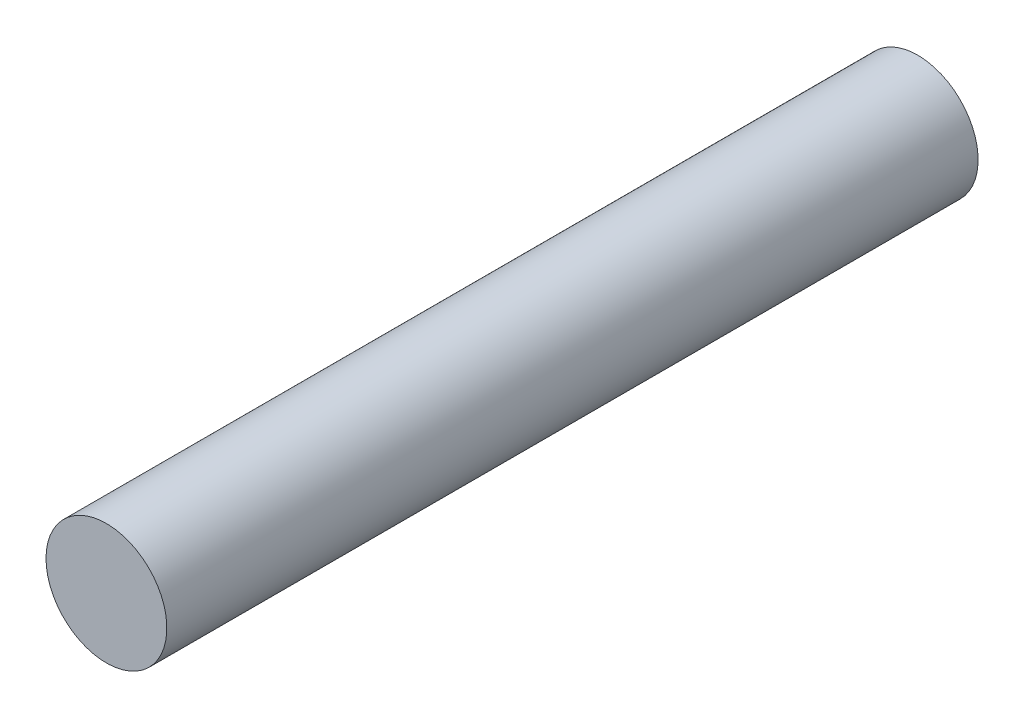
ISO-10303-21;
HEADER;
FILE_DESCRIPTION(('STEP AP214'),'2;1');
FILE_NAME('part.step','',(''),(''),'','','');
FILE_SCHEMA(('AUTOMOTIVE_DESIGN { 1 0 10303 214 1 1 1 1 }'));
ENDSEC;
DATA;
#1=APPLICATION_CONTEXT('core data for automotive mechanical design processes');
#2=APPLICATION_PROTOCOL_DEFINITION('international standard','automotive_design',2000,#1);
#3=PRODUCT_CONTEXT('',#1,'mechanical');
#4=PRODUCT('Part','Part','',(#3));
#5=PRODUCT_RELATED_PRODUCT_CATEGORY('part','',(#4));
#6=PRODUCT_DEFINITION_FORMATION('','',#4);
#7=PRODUCT_DEFINITION_CONTEXT('part definition',#1,'design');
#8=PRODUCT_DEFINITION('design','',#6,#7);
#9=PRODUCT_DEFINITION_SHAPE('','',#8);
#10=(LENGTH_UNIT() NAMED_UNIT(*) SI_UNIT(.MILLI.,.METRE.));
#11=(NAMED_UNIT(*) PLANE_ANGLE_UNIT() SI_UNIT($,.RADIAN.));
#12=(NAMED_UNIT(*) SI_UNIT($,.STERADIAN.) SOLID_ANGLE_UNIT());
#13=UNCERTAINTY_MEASURE_WITH_UNIT(LENGTH_MEASURE(1.E-05),#10,'distance_accuracy_value','');
#14=(GEOMETRIC_REPRESENTATION_CONTEXT(3) GLOBAL_UNCERTAINTY_ASSIGNED_CONTEXT((#13)) GLOBAL_UNIT_ASSIGNED_CONTEXT((#10,
#11,#12)) REPRESENTATION_CONTEXT('',''));
#15=CARTESIAN_POINT('',(0.,0.,0.));
#16=DIRECTION('',(0.,0.,1.));
#17=DIRECTION('',(1.,0.,0.));
#18=AXIS2_PLACEMENT_3D('',#15,#16,#17);
#19=CARTESIAN_POINT('',(0.,0.,53.7));
#20=DIRECTION('',(0.,0.,-1.));
#21=DIRECTION('',(-1.,0.,0.));
#22=AXIS2_PLACEMENT_3D('',#19,#20,#21);
#23=CYLINDRICAL_SURFACE('',#22,4.);
#24=CARTESIAN_POINT('',(0.,0.,53.7));
#25=DIRECTION('',(0.,0.,1.));
#26=DIRECTION('',(1.,0.,0.));
#27=AXIS2_PLACEMENT_3D('',#24,#25,#26);
#28=CIRCLE('',#27,4.);
#29=CARTESIAN_POINT('',(-4.,0.,53.7));
#30=VERTEX_POINT('',#29);
#31=EDGE_CURVE('E10',#30,#30,#28,.T.);
#32=CARTESIAN_POINT('',(0.,0.,0.));
#33=DIRECTION('',(0.,0.,1.));
#34=DIRECTION('',(1.,0.,0.));
#35=AXIS2_PLACEMENT_3D('',#32,#33,#34);
#36=CIRCLE('',#35,4.);
#37=CARTESIAN_POINT('',(-4.,0.,0.));
#38=VERTEX_POINT('',#37);
#39=EDGE_CURVE('E48',#38,#38,#36,.T.);
#40=CARTESIAN_POINT('',(-4.,0.,53.7));
#41=CARTESIAN_POINT('',(-4.,0.,53.140625));
#42=CARTESIAN_POINT('',(-4.,0.,52.58125));
#43=CARTESIAN_POINT('',(-4.,0.,51.4625));
#44=CARTESIAN_POINT('',(-4.,0.,50.903125));
#45=CARTESIAN_POINT('',(-4.,0.,49.784375));
#46=CARTESIAN_POINT('',(-4.,0.,49.225));
#47=CARTESIAN_POINT('',(-4.,0.,48.10625));
#48=CARTESIAN_POINT('',(-4.,0.,47.546875));
#49=CARTESIAN_POINT('',(-4.,0.,46.428125));
#50=CARTESIAN_POINT('',(-4.,0.,45.86875));
#51=CARTESIAN_POINT('',(-4.,0.,44.75));
#52=CARTESIAN_POINT('',(-4.,0.,44.190625));
#53=CARTESIAN_POINT('',(-4.,0.,43.071875));
#54=CARTESIAN_POINT('',(-4.,0.,42.5125));
#55=CARTESIAN_POINT('',(-4.,0.,41.39375));
#56=CARTESIAN_POINT('',(-4.,0.,40.834375));
#57=CARTESIAN_POINT('',(-4.,0.,39.715625));
#58=CARTESIAN_POINT('',(-4.,0.,39.15625));
#59=CARTESIAN_POINT('',(-4.,0.,38.0375));
#60=CARTESIAN_POINT('',(-4.,0.,37.478125));
#61=CARTESIAN_POINT('',(-4.,0.,36.359375));
#62=CARTESIAN_POINT('',(-4.,0.,35.8));
#63=CARTESIAN_POINT('',(-4.,0.,34.68125));
#64=CARTESIAN_POINT('',(-4.,0.,34.121875));
#65=CARTESIAN_POINT('',(-4.,0.,33.003125));
#66=CARTESIAN_POINT('',(-4.,0.,32.44375));
#67=CARTESIAN_POINT('',(-4.,0.,31.325));
#68=CARTESIAN_POINT('',(-4.,0.,30.765625));
#69=CARTESIAN_POINT('',(-4.,0.,29.646875));
#70=CARTESIAN_POINT('',(-4.,0.,29.0875));
#71=CARTESIAN_POINT('',(-4.,0.,27.96875));
#72=CARTESIAN_POINT('',(-4.,0.,27.409375));
#73=CARTESIAN_POINT('',(-4.,0.,26.290625));
#74=CARTESIAN_POINT('',(-4.,0.,25.73125));
#75=CARTESIAN_POINT('',(-4.,0.,24.6125));
#76=CARTESIAN_POINT('',(-4.,0.,24.053125));
#77=CARTESIAN_POINT('',(-4.,0.,22.934375));
#78=CARTESIAN_POINT('',(-4.,0.,22.375));
#79=CARTESIAN_POINT('',(-4.,0.,21.25625));
#80=CARTESIAN_POINT('',(-4.,0.,20.696875));
#81=CARTESIAN_POINT('',(-4.,0.,19.578125));
#82=CARTESIAN_POINT('',(-4.,0.,19.01875));
#83=CARTESIAN_POINT('',(-4.,0.,17.9));
#84=CARTESIAN_POINT('',(-4.,0.,17.340625));
#85=CARTESIAN_POINT('',(-4.,0.,16.221875));
#86=CARTESIAN_POINT('',(-4.,0.,15.6625));
#87=CARTESIAN_POINT('',(-4.,0.,14.54375));
#88=CARTESIAN_POINT('',(-4.,0.,13.984375));
#89=CARTESIAN_POINT('',(-4.,0.,12.865625));
#90=CARTESIAN_POINT('',(-4.,0.,12.30625));
#91=CARTESIAN_POINT('',(-4.,0.,11.1875));
#92=CARTESIAN_POINT('',(-4.,0.,10.628125));
#93=CARTESIAN_POINT('',(-4.,0.,9.509375));
#94=CARTESIAN_POINT('',(-4.,0.,8.95));
#95=CARTESIAN_POINT('',(-4.,0.,7.83125));
#96=CARTESIAN_POINT('',(-4.,0.,7.271875));
#97=CARTESIAN_POINT('',(-4.,0.,6.153125));
#98=CARTESIAN_POINT('',(-4.,0.,5.59375));
#99=CARTESIAN_POINT('',(-4.,0.,4.475));
#100=CARTESIAN_POINT('',(-4.,0.,3.915625));
#101=CARTESIAN_POINT('',(-4.,0.,2.796875));
#102=CARTESIAN_POINT('',(-4.,0.,2.2375));
#103=CARTESIAN_POINT('',(-4.,0.,1.11875));
#104=CARTESIAN_POINT('',(-4.,0.,0.559375000000002));
#105=CARTESIAN_POINT('',(-4.,0.,0.));
#106=B_SPLINE_CURVE_WITH_KNOTS('',3,(#40,#41,#42,#43,#44,#45,#46,#47,#48,#49,#50,#51,#52,#53,
#54,#55,#56,#57,#58,#59,#60,#61,#62,#63,#64,#65,#66,#67,#68,#69,#70,#71,#72,#73,#74,#75,#76,#77,
#78,#79,#80,#81,#82,#83,#84,#85,#86,#87,#88,#89,#90,#91,#92,#93,#94,#95,#96,#97,#98,#99,#100,
#101,#102,#103,#104,#105),.UNSPECIFIED.,.F.,.F.,(4,2,2,2,2,2,2,2,2,2,2,2,2,2,2,2,2,2,2,2,2,2,2,
2,2,2,2,2,2,2,2,2,4),(0.,1.678125,3.35625,5.03437499999999,6.7125,8.390625,10.06875,11.746875,
13.425,15.103125,16.78125,18.459375,20.1375,21.815625,23.49375,25.171875,26.85,28.528125,
30.20625,31.884375,33.5625,35.240625,36.91875,38.596875,40.275,41.953125,43.63125,45.309375,
46.9875,48.665625,50.34375,52.021875,53.7),.UNSPECIFIED.);
#107=EDGE_CURVE('BSEAM45',#30,#38,#106,.T.);
#108=ORIENTED_EDGE('',*,*,#31,.F.);
#109=ORIENTED_EDGE('',*,*,#39,.T.);
#110=ORIENTED_EDGE('',*,*,#107,.T.);
#111=ORIENTED_EDGE('',*,*,#107,.F.);
#112=EDGE_LOOP('',(#108,#110,#109,#111));
#113=FACE_BOUND('',#112,.T.);
#114=ADVANCED_FACE('F45',(#113),#23,.T.);
#115=CARTESIAN_POINT('',(0.,0.,53.7));
#116=DIRECTION('',(0.,0.,1.));
#117=DIRECTION('',(1.,0.,0.));
#118=AXIS2_PLACEMENT_3D('',#115,#116,#117);
#119=PLANE('',#118);
#120=ORIENTED_EDGE('',*,*,#31,.T.);
#121=EDGE_LOOP('',(#120));
#122=FACE_BOUND('',#121,.T.);
#123=ADVANCED_FACE('F62',(#122),#119,.T.);
#124=CARTESIAN_POINT('',(0.,0.,0.));
#125=DIRECTION('',(0.,0.,1.));
#126=DIRECTION('',(1.,0.,0.));
#127=AXIS2_PLACEMENT_3D('',#124,#125,#126);
#128=PLANE('',#127);
#129=ORIENTED_EDGE('',*,*,#39,.F.);
#130=EDGE_LOOP('',(#129));
#131=FACE_BOUND('',#130,.T.);
#132=ADVANCED_FACE('F60',(#131),#128,.F.);
#133=CLOSED_SHELL('',(#114,#123,#132));
#134=MANIFOLD_SOLID_BREP('B2',#133);
#135=ADVANCED_BREP_SHAPE_REPRESENTATION('',(#18,#134),#14);
#136=SHAPE_DEFINITION_REPRESENTATION(#9,#135);
ENDSEC;
END-ISO-10303-21;
